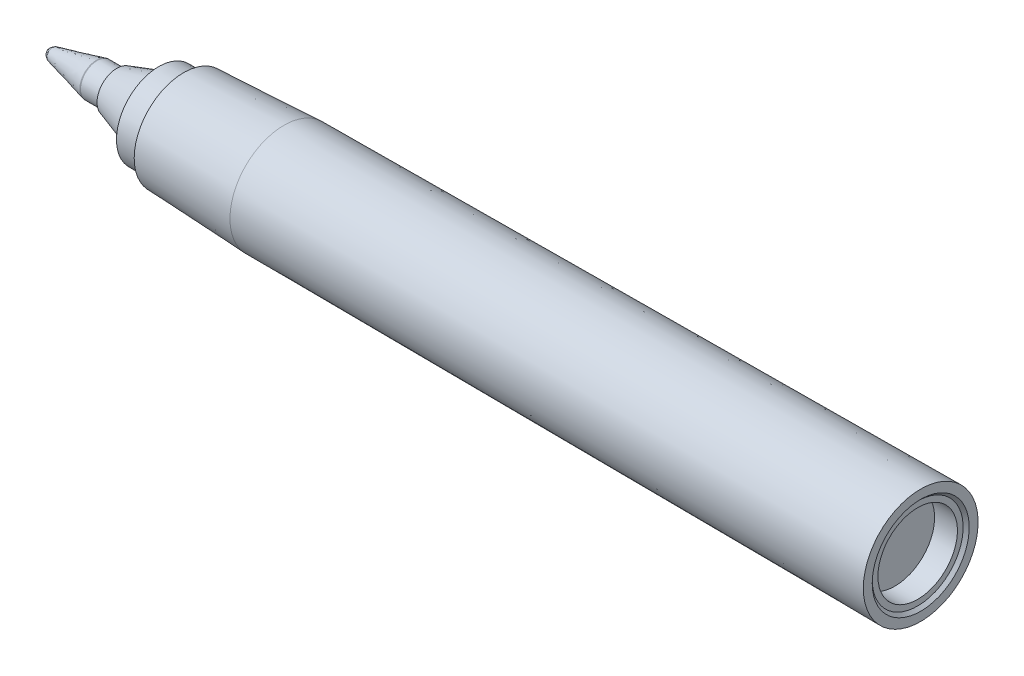
ISO-10303-21;
HEADER;
FILE_DESCRIPTION(('STEP AP214'),'2;1');
FILE_NAME('part.step','',(''),(''),'','','');
FILE_SCHEMA(('AUTOMOTIVE_DESIGN { 1 0 10303 214 1 1 1 1 }'));
ENDSEC;
DATA;
#1=APPLICATION_CONTEXT('core data for automotive mechanical design processes');
#2=APPLICATION_PROTOCOL_DEFINITION('international standard','automotive_design',2000,#1);
#3=PRODUCT_CONTEXT('',#1,'mechanical');
#4=PRODUCT('Part','Part','',(#3));
#5=PRODUCT_RELATED_PRODUCT_CATEGORY('part','',(#4));
#6=PRODUCT_DEFINITION_FORMATION('','',#4);
#7=PRODUCT_DEFINITION_CONTEXT('part definition',#1,'design');
#8=PRODUCT_DEFINITION('design','',#6,#7);
#9=PRODUCT_DEFINITION_SHAPE('','',#8);
#10=(LENGTH_UNIT() NAMED_UNIT(*) SI_UNIT(.MILLI.,.METRE.));
#11=(NAMED_UNIT(*) PLANE_ANGLE_UNIT() SI_UNIT($,.RADIAN.));
#12=(NAMED_UNIT(*) SI_UNIT($,.STERADIAN.) SOLID_ANGLE_UNIT());
#13=UNCERTAINTY_MEASURE_WITH_UNIT(LENGTH_MEASURE(1.E-05),#10,'distance_accuracy_value','');
#14=(GEOMETRIC_REPRESENTATION_CONTEXT(3) GLOBAL_UNCERTAINTY_ASSIGNED_CONTEXT((#13)) GLOBAL_UNIT_ASSIGNED_CONTEXT((#10,
#11,#12)) REPRESENTATION_CONTEXT('',''));
#15=CARTESIAN_POINT('',(0.,0.,0.));
#16=DIRECTION('',(0.,0.,1.));
#17=DIRECTION('',(1.,0.,0.));
#18=AXIS2_PLACEMENT_3D('',#15,#16,#17);
#19=CARTESIAN_POINT('',(0.,0.,0.));
#20=DIRECTION('',(-1.,0.,0.));
#21=DIRECTION('',(0.,0.,1.));
#22=AXIS2_PLACEMENT_3D('',#19,#20,#21);
#23=CYLINDRICAL_SURFACE('',#22,1.09999999999991);
#24=CARTESIAN_POINT('',(8.50261962837794,0.,0.));
#25=DIRECTION('',(-1.,0.,0.));
#26=DIRECTION('',(0.,0.,1.));
#27=AXIS2_PLACEMENT_3D('',#24,#25,#26);
#28=CIRCLE('',#27,1.09999999999991);
#29=CARTESIAN_POINT('',(8.50261962837794,0.,1.09999999999991));
#30=VERTEX_POINT('',#29);
#31=EDGE_CURVE('E11',#30,#30,#28,.T.);
#32=ORIENTED_EDGE('',*,*,#31,.F.);
#33=EDGE_LOOP('',(#32));
#34=FACE_BOUND('',#33,.T.);
#35=CARTESIAN_POINT('',(4.51671057128805,0.,0.));
#36=DIRECTION('',(-1.,0.,0.));
#37=DIRECTION('',(0.,0.,1.));
#38=AXIS2_PLACEMENT_3D('',#35,#36,#37);
#39=CIRCLE('',#38,1.09999999999991);
#40=CARTESIAN_POINT('',(4.51671057128805,0.,1.09999999999991));
#41=VERTEX_POINT('',#40);
#42=EDGE_CURVE('E92',#41,#41,#39,.T.);
#43=ORIENTED_EDGE('',*,*,#42,.T.);
#44=EDGE_LOOP('',(#43));
#45=FACE_BOUND('',#44,.T.);
#46=ADVANCED_FACE('F47',(#34,#45),#23,.F.);
#47=CARTESIAN_POINT('',(8.50261962837531,0.,0.));
#48=DIRECTION('',(1.,0.,0.));
#49=DIRECTION('',(0.,0.,-1.));
#50=AXIS2_PLACEMENT_3D('',#47,#48,#49);
#51=PLANE('',#50);
#52=ORIENTED_EDGE('',*,*,#31,.T.);
#53=EDGE_LOOP('',(#52));
#54=FACE_BOUND('',#53,.T.);
#55=ADVANCED_FACE('F148',(#54),#51,.F.);
#56=CARTESIAN_POINT('',(55.7113816910496,2.61437275918935,0.));
#57=DIRECTION('',(-1.,0.,0.));
#58=DIRECTION('',(0.,0.,1.));
#59=AXIS2_PLACEMENT_3D('',#56,#57,#58);
#60=PLANE('',#59);
#61=CARTESIAN_POINT('',(55.7113816910496,0.,0.));
#62=DIRECTION('',(-1.,0.,0.));
#63=DIRECTION('',(0.,0.,1.));
#64=AXIS2_PLACEMENT_3D('',#61,#62,#63);
#65=CIRCLE('',#64,2.61437275918934);
#66=CARTESIAN_POINT('',(55.7113816910496,0.,2.61437275918934));
#67=VERTEX_POINT('',#66);
#68=EDGE_CURVE('E54',#67,#67,#65,.T.);
#69=ORIENTED_EDGE('',*,*,#68,.F.);
#70=EDGE_LOOP('',(#69));
#71=FACE_BOUND('',#70,.T.);
#72=ADVANCED_FACE('F143',(#71),#60,.F.);
#73=CARTESIAN_POINT('',(55.5113816910399,0.,0.));
#74=DIRECTION('',(-1.,0.,0.));
#75=DIRECTION('',(0.,0.,1.));
#76=AXIS2_PLACEMENT_3D('',#73,#74,#75);
#77=TOROIDAL_SURFACE('',#76,2.61437275917972,0.200000000009678);
#78=CARTESIAN_POINT('',(55.510774492981,0.,0.));
#79=DIRECTION('',(-1.,0.,0.));
#80=DIRECTION('',(0.,0.,1.));
#81=AXIS2_PLACEMENT_3D('',#78,#79,#80);
#82=CIRCLE('',#81,2.81437183746357);
#83=CARTESIAN_POINT('',(55.510774492981,0.,2.81437183746357));
#84=VERTEX_POINT('',#83);
#85=EDGE_CURVE('E60',#84,#84,#82,.T.);
#86=ORIENTED_EDGE('',*,*,#85,.F.);
#87=EDGE_LOOP('',(#86));
#88=FACE_BOUND('',#87,.T.);
#89=ORIENTED_EDGE('',*,*,#68,.T.);
#90=EDGE_LOOP('',(#89));
#91=FACE_BOUND('',#90,.T.);
#92=ADVANCED_FACE('F138',(#88,#91),#77,.T.);
#93=CARTESIAN_POINT('',(55.510774492981,0.,0.));
#94=DIRECTION('',(1.,0.,0.));
#95=DIRECTION('',(0.,0.,-1.));
#96=AXIS2_PLACEMENT_3D('',#93,#94,#95);
#97=CONICAL_SURFACE('',#96,2.81437183746357,0.00422017130486288);
#98=CARTESIAN_POINT('',(31.133148246512,0.,0.));
#99=DIRECTION('',(-1.,0.,0.));
#100=DIRECTION('',(0.,0.,1.));
#101=AXIS2_PLACEMENT_3D('',#98,#99,#100);
#102=CIRCLE('',#101,2.71149346794752);
#103=CARTESIAN_POINT('',(31.133148246512,0.,2.71149346794752));
#104=VERTEX_POINT('',#103);
#105=EDGE_CURVE('E66',#104,#104,#102,.T.);
#106=ORIENTED_EDGE('',*,*,#105,.F.);
#107=EDGE_LOOP('',(#106));
#108=FACE_BOUND('',#107,.T.);
#109=ORIENTED_EDGE('',*,*,#85,.T.);
#110=EDGE_LOOP('',(#109));
#111=FACE_BOUND('',#110,.T.);
#112=ADVANCED_FACE('F132',(#108,#111),#97,.T.);
#113=CARTESIAN_POINT('',(25.5505978630776,0.,0.));
#114=DIRECTION('',(-1.,0.,0.));
#115=DIRECTION('',(0.,0.,1.));
#116=AXIS2_PLACEMENT_3D('',#113,#114,#115);
#117=DEGENERATE_TOROIDAL_SURFACE('',#116,318.3748413353,321.13486149306,.F.);
#118=CARTESIAN_POINT('',(10.9274143015883,0.,0.));
#119=DIRECTION('',(-1.,0.,0.));
#120=DIRECTION('',(0.,0.,1.));
#121=AXIS2_PLACEMENT_3D('',#118,#119,#120);
#122=CIRCLE('',#121,2.42690705253801);
#123=CARTESIAN_POINT('',(10.9274143015883,0.,2.42690705253801));
#124=VERTEX_POINT('',#123);
#125=EDGE_CURVE('E72',#124,#124,#122,.T.);
#126=ORIENTED_EDGE('',*,*,#125,.F.);
#127=EDGE_LOOP('',(#126));
#128=FACE_BOUND('',#127,.T.);
#129=ORIENTED_EDGE('',*,*,#105,.T.);
#130=EDGE_LOOP('',(#129));
#131=FACE_BOUND('',#130,.T.);
#132=ADVANCED_FACE('F126',(#128,#131),#117,.F.);
#133=CARTESIAN_POINT('',(0.,0.,0.));
#134=DIRECTION('',(-1.,0.,0.));
#135=DIRECTION('',(0.,0.,1.));
#136=AXIS2_PLACEMENT_3D('',#133,#134,#135);
#137=CYLINDRICAL_SURFACE('',#136,2.42690705253955);
#138=CARTESIAN_POINT('',(9.70052193133052,0.,0.));
#139=DIRECTION('',(-1.,0.,0.));
#140=DIRECTION('',(0.,0.,1.));
#141=AXIS2_PLACEMENT_3D('',#138,#139,#140);
#142=CIRCLE('',#141,2.42690705254109);
#143=CARTESIAN_POINT('',(9.70052193133052,0.,2.42690705254109));
#144=VERTEX_POINT('',#143);
#145=EDGE_CURVE('E76',#144,#144,#142,.T.);
#146=ORIENTED_EDGE('',*,*,#145,.F.);
#147=EDGE_LOOP('',(#146));
#148=FACE_BOUND('',#147,.T.);
#149=ORIENTED_EDGE('',*,*,#125,.T.);
#150=EDGE_LOOP('',(#149));
#151=FACE_BOUND('',#150,.T.);
#152=ADVANCED_FACE('F120',(#148,#151),#137,.T.);
#153=CARTESIAN_POINT('',(9.70052193133052,2.19852355134617,0.));
#154=DIRECTION('',(1.,0.,0.));
#155=DIRECTION('',(0.,0.,-1.));
#156=AXIS2_PLACEMENT_3D('',#153,#154,#155);
#157=PLANE('',#156);
#158=CARTESIAN_POINT('',(9.70052193133052,0.,0.));
#159=DIRECTION('',(-1.,0.,0.));
#160=DIRECTION('',(0.,0.,1.));
#161=AXIS2_PLACEMENT_3D('',#158,#159,#160);
#162=CIRCLE('',#161,2.19852355134617);
#163=CARTESIAN_POINT('',(9.70052193133052,0.,2.19852355134617));
#164=VERTEX_POINT('',#163);
#165=EDGE_CURVE('E80',#164,#164,#162,.T.);
#166=ORIENTED_EDGE('',*,*,#165,.F.);
#167=EDGE_LOOP('',(#166));
#168=FACE_BOUND('',#167,.T.);
#169=ORIENTED_EDGE('',*,*,#145,.T.);
#170=EDGE_LOOP('',(#169));
#171=FACE_BOUND('',#170,.T.);
#172=ADVANCED_FACE('F114',(#168,#171),#157,.F.);
#173=CARTESIAN_POINT('',(0.,0.,0.));
#174=DIRECTION('',(-1.,0.,0.));
#175=DIRECTION('',(0.,0.,1.));
#176=AXIS2_PLACEMENT_3D('',#173,#174,#175);
#177=CYLINDRICAL_SURFACE('',#176,2.19852355134617);
#178=CARTESIAN_POINT('',(7.29138169104351,0.,0.));
#179=DIRECTION('',(-1.,0.,0.));
#180=DIRECTION('',(0.,0.,1.));
#181=AXIS2_PLACEMENT_3D('',#178,#179,#180);
#182=CIRCLE('',#181,2.19852355134617);
#183=CARTESIAN_POINT('',(7.29138169104351,0.,2.19852355134617));
#184=VERTEX_POINT('',#183);
#185=EDGE_CURVE('E84',#184,#184,#182,.T.);
#186=ORIENTED_EDGE('',*,*,#185,.F.);
#187=EDGE_LOOP('',(#186));
#188=FACE_BOUND('',#187,.T.);
#189=ORIENTED_EDGE('',*,*,#165,.T.);
#190=EDGE_LOOP('',(#189));
#191=FACE_BOUND('',#190,.T.);
#192=ADVANCED_FACE('F108',(#188,#191),#177,.T.);
#193=CARTESIAN_POINT('',(7.29138169104351,0.,0.));
#194=DIRECTION('',(1.,0.,0.));
#195=DIRECTION('',(0.,0.,-1.));
#196=AXIS2_PLACEMENT_3D('',#193,#194,#195);
#197=CONICAL_SURFACE('',#196,2.19852355134617,0.312659533397963);
#198=CARTESIAN_POINT('',(4.51671057128805,0.,0.));
#199=DIRECTION('',(-1.,0.,0.));
#200=DIRECTION('',(0.,0.,1.));
#201=AXIS2_PLACEMENT_3D('',#198,#199,#200);
#202=CIRCLE('',#201,1.30157659585847);
#203=CARTESIAN_POINT('',(4.51671057128805,0.,1.30157659585847));
#204=VERTEX_POINT('',#203);
#205=EDGE_CURVE('E88',#204,#204,#202,.T.);
#206=ORIENTED_EDGE('',*,*,#205,.F.);
#207=EDGE_LOOP('',(#206));
#208=FACE_BOUND('',#207,.T.);
#209=ORIENTED_EDGE('',*,*,#185,.T.);
#210=EDGE_LOOP('',(#209));
#211=FACE_BOUND('',#210,.T.);
#212=ADVANCED_FACE('F102',(#208,#211),#197,.T.);
#213=CARTESIAN_POINT('',(4.51671057128805,1.09999999999991,0.));
#214=DIRECTION('',(1.,0.,0.));
#215=DIRECTION('',(0.,0.,-1.));
#216=AXIS2_PLACEMENT_3D('',#213,#214,#215);
#217=PLANE('',#216);
#218=ORIENTED_EDGE('',*,*,#42,.F.);
#219=EDGE_LOOP('',(#218));
#220=FACE_BOUND('',#219,.T.);
#221=ORIENTED_EDGE('',*,*,#205,.T.);
#222=EDGE_LOOP('',(#221));
#223=FACE_BOUND('',#222,.T.);
#224=ADVANCED_FACE('F99',(#220,#223),#217,.F.);
#225=CLOSED_SHELL('',(#46,#55,#72,#92,#112,#132,#152,#172,#192,#212,#224));
#226=MANIFOLD_SOLID_BREP('B2',#225);
#227=CARTESIAN_POINT('',(0.,0.,0.));
#228=DIRECTION('',(-1.,0.,0.));
#229=DIRECTION('',(0.,0.,1.));
#230=AXIS2_PLACEMENT_3D('',#227,#228,#229);
#231=CYLINDRICAL_SURFACE('',#230,2.19852355134617);
#232=CARTESIAN_POINT('',(9.70052193133052,0.,0.));
#233=DIRECTION('',(-1.,0.,0.));
#234=DIRECTION('',(0.,0.,1.));
#235=AXIS2_PLACEMENT_3D('',#232,#233,#234);
#236=CIRCLE('',#235,2.19852355134617);
#237=CARTESIAN_POINT('',(9.70052193133052,0.,2.19852355134617));
#238=VERTEX_POINT('',#237);
#239=EDGE_CURVE('E338',#238,#238,#236,.T.);
#240=ORIENTED_EDGE('',*,*,#239,.F.);
#241=EDGE_LOOP('',(#240));
#242=FACE_BOUND('',#241,.T.);
#243=CARTESIAN_POINT('',(7.29138169104351,0.,0.));
#244=DIRECTION('',(-1.,0.,0.));
#245=DIRECTION('',(0.,0.,1.));
#246=AXIS2_PLACEMENT_3D('',#243,#244,#245);
#247=CIRCLE('',#246,2.19852355134617);
#248=CARTESIAN_POINT('',(7.29138169104351,0.,2.19852355134617));
#249=VERTEX_POINT('',#248);
#250=EDGE_CURVE('E46',#249,#249,#247,.T.);
#251=ORIENTED_EDGE('',*,*,#250,.T.);
#252=EDGE_LOOP('',(#251));
#253=FACE_BOUND('',#252,.T.);
#254=ADVANCED_FACE('F273',(#242,#253),#231,.F.);
#255=CARTESIAN_POINT('',(7.27138169104351,0.,0.));
#256=DIRECTION('',(-1.,0.,0.));
#257=DIRECTION('',(0.,0.,1.));
#258=AXIS2_PLACEMENT_3D('',#255,#256,#257);
#259=CONICAL_SURFACE('',#258,2.77497668867727,1.53611531011519);
#260=ORIENTED_EDGE('',*,*,#250,.F.);
#261=EDGE_LOOP('',(#260));
#262=FACE_BOUND('',#261,.T.);
#263=CARTESIAN_POINT('',(7.27138169104351,0.,0.));
#264=DIRECTION('',(-1.,0.,0.));
#265=DIRECTION('',(0.,0.,1.));
#266=AXIS2_PLACEMENT_3D('',#263,#264,#265);
#267=CIRCLE('',#266,2.77497668867727);
#268=CARTESIAN_POINT('',(7.27138169104351,0.,2.77497668867727));
#269=VERTEX_POINT('',#268);
#270=EDGE_CURVE('E280',#269,#269,#267,.T.);
#271=ORIENTED_EDGE('',*,*,#270,.T.);
#272=EDGE_LOOP('',(#271));
#273=FACE_BOUND('',#272,.T.);
#274=ADVANCED_FACE('F347',(#262,#273),#259,.F.);
#275=CARTESIAN_POINT('',(8.91138169108489,0.,0.));
#276=DIRECTION('',(1.,0.,0.));
#277=DIRECTION('',(0.,0.,-1.));
#278=AXIS2_PLACEMENT_3D('',#275,#276,#277);
#279=CONICAL_SURFACE('',#278,2.7899766886776,0.00914608642874289);
#280=ORIENTED_EDGE('',*,*,#270,.F.);
#281=EDGE_LOOP('',(#280));
#282=FACE_BOUND('',#281,.T.);
#283=CARTESIAN_POINT('',(8.91138169108489,0.,0.));
#284=DIRECTION('',(-1.,0.,0.));
#285=DIRECTION('',(0.,0.,1.));
#286=AXIS2_PLACEMENT_3D('',#283,#284,#285);
#287=CIRCLE('',#286,2.7899766886776);
#288=CARTESIAN_POINT('',(8.91138169108489,0.,2.7899766886776));
#289=VERTEX_POINT('',#288);
#290=EDGE_CURVE('E286',#289,#289,#287,.T.);
#291=ORIENTED_EDGE('',*,*,#290,.T.);
#292=EDGE_LOOP('',(#291));
#293=FACE_BOUND('',#292,.T.);
#294=ADVANCED_FACE('F351',(#282,#293),#279,.T.);
#295=CARTESIAN_POINT('',(8.91138169108489,3.24997668867762,0.));
#296=DIRECTION('',(1.,0.,0.));
#297=DIRECTION('',(0.,0.,-1.));
#298=AXIS2_PLACEMENT_3D('',#295,#296,#297);
#299=PLANE('',#298);
#300=ORIENTED_EDGE('',*,*,#290,.F.);
#301=EDGE_LOOP('',(#300));
#302=FACE_BOUND('',#301,.T.);
#303=CARTESIAN_POINT('',(8.91138169108489,0.,0.));
#304=DIRECTION('',(-1.,0.,0.));
#305=DIRECTION('',(0.,0.,1.));
#306=AXIS2_PLACEMENT_3D('',#303,#304,#305);
#307=CIRCLE('',#306,3.24997668867763);
#308=CARTESIAN_POINT('',(8.91138169108489,0.,3.24997668867763));
#309=VERTEX_POINT('',#308);
#310=EDGE_CURVE('E292',#309,#309,#307,.T.);
#311=ORIENTED_EDGE('',*,*,#310,.T.);
#312=EDGE_LOOP('',(#311));
#313=FACE_BOUND('',#312,.T.);
#314=ADVANCED_FACE('F356',(#302,#313),#299,.F.);
#315=CARTESIAN_POINT('',(15.5113816910853,0.,0.));
#316=DIRECTION('',(1.,0.,0.));
#317=DIRECTION('',(0.,0.,-1.));
#318=AXIS2_PLACEMENT_3D('',#315,#316,#317);
#319=CONICAL_SURFACE('',#318,3.54997668867828,0.0454232794216723);
#320=ORIENTED_EDGE('',*,*,#310,.F.);
#321=EDGE_LOOP('',(#320));
#322=FACE_BOUND('',#321,.T.);
#323=CARTESIAN_POINT('',(15.5113816910853,0.,0.));
#324=DIRECTION('',(-1.,0.,0.));
#325=DIRECTION('',(0.,0.,1.));
#326=AXIS2_PLACEMENT_3D('',#323,#324,#325);
#327=CIRCLE('',#326,3.54997668867828);
#328=CARTESIAN_POINT('',(15.5113816910853,0.,3.54997668867828));
#329=VERTEX_POINT('',#328);
#330=EDGE_CURVE('E298',#329,#329,#327,.T.);
#331=ORIENTED_EDGE('',*,*,#330,.T.);
#332=EDGE_LOOP('',(#331));
#333=FACE_BOUND('',#332,.T.);
#334=ADVANCED_FACE('F362',(#322,#333),#319,.T.);
#335=CARTESIAN_POINT('',(57.4113816910467,0.,0.));
#336=DIRECTION('',(1.,0.,0.));
#337=DIRECTION('',(0.,0.,-1.));
#338=AXIS2_PLACEMENT_3D('',#335,#336,#337);
#339=CONICAL_SURFACE('',#338,3.77605582537217,0.00539563109200447);
#340=ORIENTED_EDGE('',*,*,#330,.F.);
#341=EDGE_LOOP('',(#340));
#342=FACE_BOUND('',#341,.T.);
#343=CARTESIAN_POINT('',(57.4113816910467,0.,0.));
#344=DIRECTION('',(-1.,0.,0.));
#345=DIRECTION('',(0.,0.,1.));
#346=AXIS2_PLACEMENT_3D('',#343,#344,#345);
#347=CIRCLE('',#346,3.77605582537217);
#348=CARTESIAN_POINT('',(57.4113816910467,0.,3.77605582537217));
#349=VERTEX_POINT('',#348);
#350=EDGE_CURVE('E302',#349,#349,#347,.T.);
#351=ORIENTED_EDGE('',*,*,#350,.T.);
#352=EDGE_LOOP('',(#351));
#353=FACE_BOUND('',#352,.T.);
#354=ADVANCED_FACE('F366',(#342,#353),#339,.T.);
#355=CARTESIAN_POINT('',(57.4113816910451,3.19137086155206,0.));
#356=DIRECTION('',(-1.,0.,0.));
#357=DIRECTION('',(0.,0.,1.));
#358=AXIS2_PLACEMENT_3D('',#355,#356,#357);
#359=PLANE('',#358);
#360=ORIENTED_EDGE('',*,*,#350,.F.);
#361=EDGE_LOOP('',(#360));
#362=FACE_BOUND('',#361,.T.);
#363=CARTESIAN_POINT('',(57.4113816910435,0.,0.));
#364=DIRECTION('',(-1.,0.,0.));
#365=DIRECTION('',(0.,0.,1.));
#366=AXIS2_PLACEMENT_3D('',#363,#364,#365);
#367=CIRCLE('',#366,3.19137086155206);
#368=CARTESIAN_POINT('',(57.4113816910435,0.,3.19137086155207));
#369=VERTEX_POINT('',#368);
#370=EDGE_CURVE('E306',#369,#369,#367,.T.);
#371=ORIENTED_EDGE('',*,*,#370,.T.);
#372=EDGE_LOOP('',(#371));
#373=FACE_BOUND('',#372,.T.);
#374=ADVANCED_FACE('F370',(#362,#373),#359,.F.);
#375=CARTESIAN_POINT('',(57.2113816910496,0.,0.));
#376=DIRECTION('',(1.,0.,0.));
#377=DIRECTION('',(0.,0.,-1.));
#378=AXIS2_PLACEMENT_3D('',#375,#376,#377);
#379=CONICAL_SURFACE('',#378,2.99137086155815,0.785398163397483);
#380=ORIENTED_EDGE('',*,*,#370,.F.);
#381=EDGE_LOOP('',(#380));
#382=FACE_BOUND('',#381,.T.);
#383=CARTESIAN_POINT('',(57.2113816910496,0.,0.));
#384=DIRECTION('',(-1.,0.,0.));
#385=DIRECTION('',(0.,0.,1.));
#386=AXIS2_PLACEMENT_3D('',#383,#384,#385);
#387=CIRCLE('',#386,2.99137086155815);
#388=CARTESIAN_POINT('',(57.2113816910496,0.,2.99137086155815));
#389=VERTEX_POINT('',#388);
#390=EDGE_CURVE('E310',#389,#389,#387,.T.);
#391=ORIENTED_EDGE('',*,*,#390,.T.);
#392=EDGE_LOOP('',(#391));
#393=FACE_BOUND('',#392,.T.);
#394=ADVANCED_FACE('F374',(#382,#393),#379,.F.);
#395=CARTESIAN_POINT('',(57.2113816910496,2.61437275918935,0.));
#396=DIRECTION('',(-1.,0.,0.));
#397=DIRECTION('',(0.,0.,1.));
#398=AXIS2_PLACEMENT_3D('',#395,#396,#397);
#399=PLANE('',#398);
#400=ORIENTED_EDGE('',*,*,#390,.F.);
#401=EDGE_LOOP('',(#400));
#402=FACE_BOUND('',#401,.T.);
#403=CARTESIAN_POINT('',(57.2113816910496,0.,0.));
#404=DIRECTION('',(-1.,0.,0.));
#405=DIRECTION('',(0.,0.,1.));
#406=AXIS2_PLACEMENT_3D('',#403,#404,#405);
#407=CIRCLE('',#406,2.61437275918934);
#408=CARTESIAN_POINT('',(57.2113816910496,0.,2.61437275918934));
#409=VERTEX_POINT('',#408);
#410=EDGE_CURVE('E314',#409,#409,#407,.T.);
#411=ORIENTED_EDGE('',*,*,#410,.T.);
#412=EDGE_LOOP('',(#411));
#413=FACE_BOUND('',#412,.T.);
#414=ADVANCED_FACE('F378',(#402,#413),#399,.F.);
#415=CARTESIAN_POINT('',(0.,0.,0.));
#416=DIRECTION('',(-1.,0.,0.));
#417=DIRECTION('',(0.,0.,1.));
#418=AXIS2_PLACEMENT_3D('',#415,#416,#417);
#419=CYLINDRICAL_SURFACE('',#418,2.61437275918934);
#420=ORIENTED_EDGE('',*,*,#410,.F.);
#421=EDGE_LOOP('',(#420));
#422=FACE_BOUND('',#421,.T.);
#423=CARTESIAN_POINT('',(55.7113816910496,0.,0.));
#424=DIRECTION('',(-1.,0.,0.));
#425=DIRECTION('',(0.,0.,1.));
#426=AXIS2_PLACEMENT_3D('',#423,#424,#425);
#427=CIRCLE('',#426,2.61437275918934);
#428=CARTESIAN_POINT('',(55.7113816910496,0.,2.61437275918934));
#429=VERTEX_POINT('',#428);
#430=EDGE_CURVE('E318',#429,#429,#427,.T.);
#431=ORIENTED_EDGE('',*,*,#430,.T.);
#432=EDGE_LOOP('',(#431));
#433=FACE_BOUND('',#432,.T.);
#434=ADVANCED_FACE('F382',(#422,#433),#419,.F.);
#435=CARTESIAN_POINT('',(55.5113816910399,0.,0.));
#436=DIRECTION('',(-1.,0.,0.));
#437=DIRECTION('',(0.,0.,1.));
#438=AXIS2_PLACEMENT_3D('',#435,#436,#437);
#439=TOROIDAL_SURFACE('',#438,2.61437275917972,0.200000000009678);
#440=ORIENTED_EDGE('',*,*,#430,.F.);
#441=EDGE_LOOP('',(#440));
#442=FACE_BOUND('',#441,.T.);
#443=CARTESIAN_POINT('',(55.510774492981,0.,0.));
#444=DIRECTION('',(-1.,0.,0.));
#445=DIRECTION('',(0.,0.,1.));
#446=AXIS2_PLACEMENT_3D('',#443,#444,#445);
#447=CIRCLE('',#446,2.81437183746357);
#448=CARTESIAN_POINT('',(55.510774492981,0.,2.81437183746357));
#449=VERTEX_POINT('',#448);
#450=EDGE_CURVE('E322',#449,#449,#447,.T.);
#451=ORIENTED_EDGE('',*,*,#450,.T.);
#452=EDGE_LOOP('',(#451));
#453=FACE_BOUND('',#452,.T.);
#454=ADVANCED_FACE('F386',(#442,#453),#439,.F.);
#455=CARTESIAN_POINT('',(31.1331482465121,0.,0.));
#456=DIRECTION('',(1.,0.,0.));
#457=DIRECTION('',(0.,0.,-1.));
#458=AXIS2_PLACEMENT_3D('',#455,#456,#457);
#459=CONICAL_SURFACE('',#458,2.71149346794436,0.00422017130499267);
#460=ORIENTED_EDGE('',*,*,#450,.F.);
#461=EDGE_LOOP('',(#460));
#462=FACE_BOUND('',#461,.T.);
#463=CARTESIAN_POINT('',(31.1331482465121,0.,0.));
#464=DIRECTION('',(-1.,0.,0.));
#465=DIRECTION('',(0.,0.,1.));
#466=AXIS2_PLACEMENT_3D('',#463,#464,#465);
#467=CIRCLE('',#466,2.71149346794436);
#468=CARTESIAN_POINT('',(31.1331482465121,0.,2.71149346794436));
#469=VERTEX_POINT('',#468);
#470=EDGE_CURVE('E326',#469,#469,#467,.T.);
#471=ORIENTED_EDGE('',*,*,#470,.T.);
#472=EDGE_LOOP('',(#471));
#473=FACE_BOUND('',#472,.T.);
#474=ADVANCED_FACE('F390',(#462,#473),#459,.F.);
#475=CARTESIAN_POINT('',(25.5505978630776,0.,0.));
#476=DIRECTION('',(-1.,0.,0.));
#477=DIRECTION('',(0.,0.,1.));
#478=AXIS2_PLACEMENT_3D('',#475,#476,#477);
#479=DEGENERATE_TOROIDAL_SURFACE('',#478,318.3748413353,321.13486149306,.F.);
#480=ORIENTED_EDGE('',*,*,#470,.F.);
#481=EDGE_LOOP('',(#480));
#482=FACE_BOUND('',#481,.T.);
#483=CARTESIAN_POINT('',(10.9274143015883,0.,0.));
#484=DIRECTION('',(-1.,0.,0.));
#485=DIRECTION('',(0.,0.,1.));
#486=AXIS2_PLACEMENT_3D('',#483,#484,#485);
#487=CIRCLE('',#486,2.42690705253801);
#488=CARTESIAN_POINT('',(10.9274143015883,0.,2.42690705253801));
#489=VERTEX_POINT('',#488);
#490=EDGE_CURVE('E330',#489,#489,#487,.T.);
#491=ORIENTED_EDGE('',*,*,#490,.T.);
#492=EDGE_LOOP('',(#491));
#493=FACE_BOUND('',#492,.T.);
#494=ADVANCED_FACE('F394',(#482,#493),#479,.T.);
#495=CARTESIAN_POINT('',(0.,0.,0.));
#496=DIRECTION('',(-1.,0.,0.));
#497=DIRECTION('',(0.,0.,1.));
#498=AXIS2_PLACEMENT_3D('',#495,#496,#497);
#499=CYLINDRICAL_SURFACE('',#498,2.42690705253955);
#500=ORIENTED_EDGE('',*,*,#490,.F.);
#501=EDGE_LOOP('',(#500));
#502=FACE_BOUND('',#501,.T.);
#503=CARTESIAN_POINT('',(9.70052193133052,0.,0.));
#504=DIRECTION('',(-1.,0.,0.));
#505=DIRECTION('',(0.,0.,1.));
#506=AXIS2_PLACEMENT_3D('',#503,#504,#505);
#507=CIRCLE('',#506,2.42690705254109);
#508=CARTESIAN_POINT('',(9.70052193133052,0.,2.42690705254109));
#509=VERTEX_POINT('',#508);
#510=EDGE_CURVE('E334',#509,#509,#507,.T.);
#511=ORIENTED_EDGE('',*,*,#510,.T.);
#512=EDGE_LOOP('',(#511));
#513=FACE_BOUND('',#512,.T.);
#514=ADVANCED_FACE('F398',(#502,#513),#499,.F.);
#515=CARTESIAN_POINT('',(9.70052193133052,2.19852355134616,0.));
#516=DIRECTION('',(-1.,0.,0.));
#517=DIRECTION('',(0.,0.,1.));
#518=AXIS2_PLACEMENT_3D('',#515,#516,#517);
#519=PLANE('',#518);
#520=ORIENTED_EDGE('',*,*,#510,.F.);
#521=EDGE_LOOP('',(#520));
#522=FACE_BOUND('',#521,.T.);
#523=ORIENTED_EDGE('',*,*,#239,.T.);
#524=EDGE_LOOP('',(#523));
#525=FACE_BOUND('',#524,.T.);
#526=ADVANCED_FACE('F344',(#522,#525),#519,.F.);
#527=CLOSED_SHELL('',(#254,#274,#294,#314,#334,#354,#374,#394,#414,#434,#454,#474,#494,#514,#526));
#528=MANIFOLD_SOLID_BREP('B6',#527);
#529=CARTESIAN_POINT('',(3.17963793760437,1.09415896780346,0.));
#530=CARTESIAN_POINT('',(1.7695728366805,0.745755337845191,0.));
#531=CARTESIAN_POINT('',(0.3366576519203,0.394881535432574,0.));
#532=CARTESIAN_POINT('',(0.300391978724435,0.386001264791089,0.));
#533=CARTESIAN_POINT('',(0.277694333652378,0.358751369697929,0.));
#534=CARTESIAN_POINT('',(0.272952880074451,0.353058968038674,0.));
#535=CARTESIAN_POINT('',(0.265895067686872,0.347116160044612,0.));
#536=(BOUNDED_CURVE() B_SPLINE_CURVE(2,(#529,#530,#531,#532,#533,#534,#535),.UNSPECIFIED.,.F.,
.F.) B_SPLINE_CURVE_WITH_KNOTS((3,2,2,3),(0.,0.96346260590031,0.99233145808713,1.),
.UNSPECIFIED.) CURVE() GEOMETRIC_REPRESENTATION_ITEM() RATIONAL_B_SPLINE_CURVE((1.,1.,1.,
0.946181298874506,1.,1.,1.)) REPRESENTATION_ITEM(''));
#537=CARTESIAN_POINT('',(-3.04333851314231E-05,-2.33113173547447E-05,0.));
#538=DIRECTION('',(-0.999999999996242,-2.74165315438487E-06,0.));
#539=AXIS1_PLACEMENT('',#537,#538);
#540=SURFACE_OF_REVOLUTION('',#536,#539);
#541=CARTESIAN_POINT('',(0.265896019420897,-2.25822392721162E-05,0.));
#542=DIRECTION('',(-0.999999999996242,-2.74165315438487E-06,0.));
#543=DIRECTION('',(2.74165315438486E-06,-0.999999999996242,0.));
#544=AXIS2_PLACEMENT_3D('',#541,#542,#543);
#545=CIRCLE('',#544,0.34713874228518);
#546=CARTESIAN_POINT('',(0.265896971154925,-0.347161324523148,0.));
#547=VERTEX_POINT('',#546);
#548=EDGE_CURVE('E271',#547,#547,#545,.T.);
#549=ORIENTED_EDGE('',*,*,#548,.F.);
#550=EDGE_LOOP('',(#549));
#551=FACE_BOUND('',#550,.T.);
#552=CARTESIAN_POINT('',(3.17964093744877,-1.45937613313385E-05,0.));
#553=DIRECTION('',(-0.999999999996242,-2.74165315438487E-06,0.));
#554=DIRECTION('',(2.74165315438486E-06,-0.999999999996242,0.));
#555=AXIS2_PLACEMENT_3D('',#552,#553,#554);
#556=CIRCLE('',#555,1.09417356156889);
#557=CARTESIAN_POINT('',(3.17964393729317,-1.09418815532611,0.));
#558=VERTEX_POINT('',#557);
#559=EDGE_CURVE('E621',#558,#558,#556,.T.);
#560=ORIENTED_EDGE('',*,*,#559,.T.);
#561=EDGE_LOOP('',(#560));
#562=FACE_BOUND('',#561,.T.);
#563=ADVANCED_FACE('F600',(#551,#562),#540,.T.);
#564=CARTESIAN_POINT('',(0.265895067686872,0.347116160044612,0.));
#565=CARTESIAN_POINT('',(-7.81059321273381E-06,0.258033040073043,0.));
#566=CARTESIAN_POINT('',(-3.04333851314231E-05,-2.33113173547447E-05,0.));
#567=(BOUNDED_CURVE() B_SPLINE_CURVE(2,(#564,#565,#566),.UNSPECIFIED.,.F.,
.F.) B_SPLINE_CURVE_WITH_KNOTS((3,3),(0.,1.),
.UNSPECIFIED.) CURVE() GEOMETRIC_REPRESENTATION_ITEM() RATIONAL_B_SPLINE_CURVE((1.,
0.820151919082165,1.)) REPRESENTATION_ITEM(''));
#568=CARTESIAN_POINT('',(-3.04333851314231E-05,-2.33113173547447E-05,0.));
#569=DIRECTION('',(-0.999999999996242,-2.74165315438487E-06,0.));
#570=AXIS1_PLACEMENT('',#568,#569);
#571=SURFACE_OF_REVOLUTION('',#567,#570);
#572=CARTESIAN_POINT('',(-3.04333851314231E-05,-2.33113173547447E-05,0.));
#573=VERTEX_POINT('',#572);
#574=VERTEX_LOOP('',#573);
#575=FACE_BOUND('',#574,.T.);
#576=ORIENTED_EDGE('',*,*,#548,.T.);
#577=EDGE_LOOP('',(#576));
#578=FACE_BOUND('',#577,.T.);
#579=ADVANCED_FACE('F611',(#575,#578),#571,.T.);
#580=CARTESIAN_POINT('',(8.50261812046869,1.09999999999577,0.));
#581=DIRECTION('',(-0.999999999996242,-2.74165315438487E-06,0.));
#582=DIRECTION('',(2.74165315438486E-06,-0.999999999996242,0.));
#583=AXIS2_PLACEMENT_3D('',#580,#581,#582);
#584=PLANE('',#583);
#585=CARTESIAN_POINT('',(8.50262264419641,8.25815110738759E-12,0.));
#586=DIRECTION('',(-0.999999999996242,-2.74165315438487E-06,0.));
#587=DIRECTION('',(2.74165315438486E-06,-0.999999999996242,0.));
#588=AXIS2_PLACEMENT_3D('',#585,#586,#587);
#589=CIRCLE('',#588,1.09999999999577);
#590=CARTESIAN_POINT('',(8.50262566001488,-1.09999999998338,0.));
#591=VERTEX_POINT('',#590);
#592=EDGE_CURVE('E608',#591,#591,#589,.T.);
#593=ORIENTED_EDGE('',*,*,#592,.F.);
#594=EDGE_LOOP('',(#593));
#595=FACE_BOUND('',#594,.T.);
#596=ADVANCED_FACE('F614',(#595),#584,.F.);
#597=CARTESIAN_POINT('',(8.50262264419641,8.25815110738759E-12,0.));
#598=DIRECTION('',(-0.999999999996242,-2.74165315438487E-06,0.));
#599=DIRECTION('',(2.74165315438486E-06,-0.999999999996242,0.));
#600=AXIS2_PLACEMENT_3D('',#597,#598,#599);
#601=CONICAL_SURFACE('',#600,1.09999999999577,2.74165315436223E-06);
#602=CARTESIAN_POINT('',(3.227623233187,-1.44622105133566E-05,0.));
#603=DIRECTION('',(-0.999999999996242,-2.74165315438487E-06,0.));
#604=DIRECTION('',(2.74165315438486E-06,-0.999999999996242,0.));
#605=AXIS2_PLACEMENT_3D('',#602,#603,#604);
#606=CIRCLE('',#605,1.10001446221455);
#607=CARTESIAN_POINT('',(3.22762624904512,-1.10002892442093,0.));
#608=VERTEX_POINT('',#607);
#609=EDGE_CURVE('E624',#608,#608,#606,.T.);
#610=ORIENTED_EDGE('',*,*,#609,.F.);
#611=EDGE_LOOP('',(#610));
#612=FACE_BOUND('',#611,.T.);
#613=ORIENTED_EDGE('',*,*,#592,.T.);
#614=EDGE_LOOP('',(#613));
#615=FACE_BOUND('',#614,.T.);
#616=ADVANCED_FACE('F639',(#612,#615),#601,.T.);
#617=CARTESIAN_POINT('',(3.22762266628794,-1.44622120529236E-05,0.));
#618=DIRECTION('',(-0.999999999996242,-2.74165315438487E-06,0.));
#619=DIRECTION('',(2.74165315438486E-06,-0.999999999996242,0.));
#620=AXIS2_PLACEMENT_3D('',#617,#618,#619);
#621=TOROIDAL_SURFACE('',#620,0.900014276953524,0.200000185261826);
#622=ORIENTED_EDGE('',*,*,#559,.F.);
#623=EDGE_LOOP('',(#622));
#624=FACE_BOUND('',#623,.T.);
#625=ORIENTED_EDGE('',*,*,#609,.T.);
#626=EDGE_LOOP('',(#625));
#627=FACE_BOUND('',#626,.T.);
#628=ADVANCED_FACE('F646',(#624,#627),#621,.T.);
#629=CLOSED_SHELL('',(#563,#579,#596,#616,#628));
#630=MANIFOLD_SOLID_BREP('B41',#629);
#631=ADVANCED_BREP_SHAPE_REPRESENTATION('',(#18,#226,#528,#630),#14);
#632=SHAPE_DEFINITION_REPRESENTATION(#9,#631);
ENDSEC;
END-ISO-10303-21;
